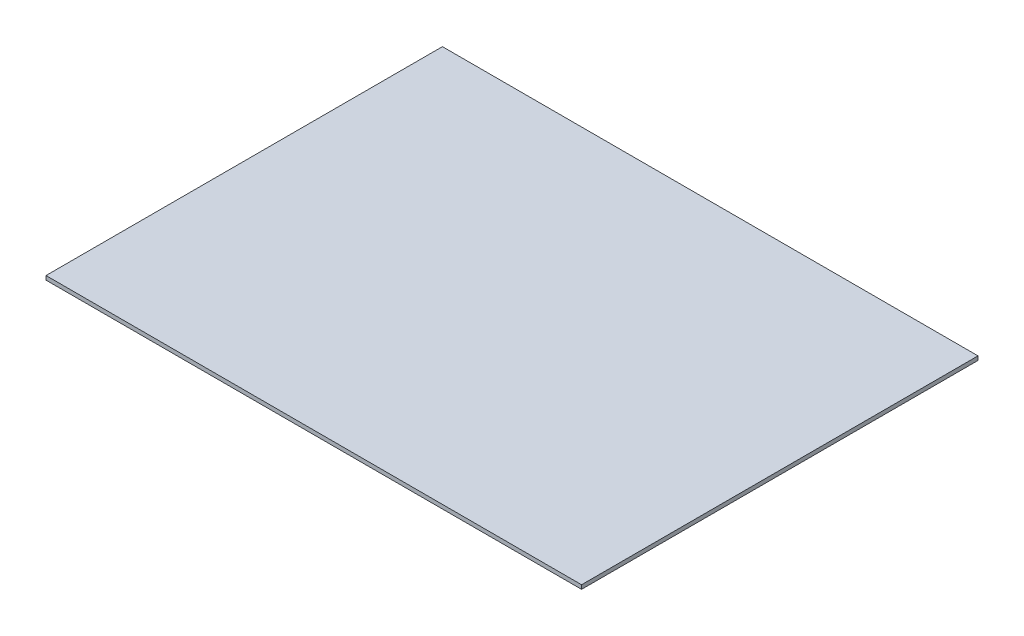
ISO-10303-21;
HEADER;
FILE_DESCRIPTION(('STEP AP214'),'2;1');
FILE_NAME('part.step','',(''),(''),'','','');
FILE_SCHEMA(('AUTOMOTIVE_DESIGN { 1 0 10303 214 1 1 1 1 }'));
ENDSEC;
DATA;
#1=APPLICATION_CONTEXT('core data for automotive mechanical design processes');
#2=APPLICATION_PROTOCOL_DEFINITION('international standard','automotive_design',2000,#1);
#3=PRODUCT_CONTEXT('',#1,'mechanical');
#4=PRODUCT('Part','Part','',(#3));
#5=PRODUCT_RELATED_PRODUCT_CATEGORY('part','',(#4));
#6=PRODUCT_DEFINITION_FORMATION('','',#4);
#7=PRODUCT_DEFINITION_CONTEXT('part definition',#1,'design');
#8=PRODUCT_DEFINITION('design','',#6,#7);
#9=PRODUCT_DEFINITION_SHAPE('','',#8);
#10=(LENGTH_UNIT() NAMED_UNIT(*) SI_UNIT(.MILLI.,.METRE.));
#11=(NAMED_UNIT(*) PLANE_ANGLE_UNIT() SI_UNIT($,.RADIAN.));
#12=(NAMED_UNIT(*) SI_UNIT($,.STERADIAN.) SOLID_ANGLE_UNIT());
#13=UNCERTAINTY_MEASURE_WITH_UNIT(LENGTH_MEASURE(1.E-05),#10,'distance_accuracy_value','');
#14=(GEOMETRIC_REPRESENTATION_CONTEXT(3) GLOBAL_UNCERTAINTY_ASSIGNED_CONTEXT((#13)) GLOBAL_UNIT_ASSIGNED_CONTEXT((#10,
#11,#12)) REPRESENTATION_CONTEXT('',''));
#15=CARTESIAN_POINT('',(0.,0.,0.));
#16=DIRECTION('',(0.,0.,1.));
#17=DIRECTION('',(1.,0.,0.));
#18=AXIS2_PLACEMENT_3D('',#15,#16,#17);
#19=CARTESIAN_POINT('',(-267.5,4.,198.));
#20=DIRECTION('',(1.,0.,0.));
#21=DIRECTION('',(0.,0.,-1.));
#22=AXIS2_PLACEMENT_3D('',#19,#20,#21);
#23=PLANE('',#22);
#24=DIRECTION('',(0.,0.,1.));
#25=VECTOR('',#24,1.);
#26=CARTESIAN_POINT('',(-267.5,0.,198.));
#27=LINE('',#26,#25);
#28=CARTESIAN_POINT('',(-267.5,0.,-198.));
#29=VERTEX_POINT('',#28);
#30=CARTESIAN_POINT('',(-267.5,0.,198.));
#31=VERTEX_POINT('',#30);
#32=EDGE_CURVE('E96',#29,#31,#27,.T.);
#33=ORIENTED_EDGE('',*,*,#32,.T.);
#34=DIRECTION('',(0.,-1.,0.));
#35=VECTOR('',#34,1.);
#36=CARTESIAN_POINT('',(-267.5,4.,198.));
#37=LINE('',#36,#35);
#38=CARTESIAN_POINT('',(-267.5,4.,198.));
#39=VERTEX_POINT('',#38);
#40=EDGE_CURVE('E11',#39,#31,#37,.T.);
#41=ORIENTED_EDGE('',*,*,#40,.F.);
#42=DIRECTION('',(0.,0.,1.));
#43=VECTOR('',#42,1.);
#44=CARTESIAN_POINT('',(-267.5,4.,198.));
#45=LINE('',#44,#43);
#46=CARTESIAN_POINT('',(-267.5,4.,-198.));
#47=VERTEX_POINT('',#46);
#48=EDGE_CURVE('E84',#47,#39,#45,.T.);
#49=ORIENTED_EDGE('',*,*,#48,.F.);
#50=DIRECTION('',(0.,-1.,0.));
#51=VECTOR('',#50,1.);
#52=CARTESIAN_POINT('',(-267.5,4.,-198.));
#53=LINE('',#52,#51);
#54=EDGE_CURVE('E92',#47,#29,#53,.T.);
#55=ORIENTED_EDGE('',*,*,#54,.T.);
#56=EDGE_LOOP('',(#33,#41,#49,#55));
#57=FACE_BOUND('',#56,.T.);
#58=ADVANCED_FACE('F33',(#57),#23,.F.);
#59=CARTESIAN_POINT('',(267.5,4.,198.));
#60=DIRECTION('',(0.,0.,-1.));
#61=DIRECTION('',(-1.,0.,0.));
#62=AXIS2_PLACEMENT_3D('',#59,#60,#61);
#63=PLANE('',#62);
#64=DIRECTION('',(1.,0.,0.));
#65=VECTOR('',#64,1.);
#66=CARTESIAN_POINT('',(267.5,0.,198.));
#67=LINE('',#66,#65);
#68=CARTESIAN_POINT('',(267.5,0.,198.));
#69=VERTEX_POINT('',#68);
#70=EDGE_CURVE('E88',#31,#69,#67,.T.);
#71=ORIENTED_EDGE('',*,*,#70,.T.);
#72=DIRECTION('',(0.,-1.,0.));
#73=VECTOR('',#72,1.);
#74=CARTESIAN_POINT('',(267.5,4.,198.));
#75=LINE('',#74,#73);
#76=CARTESIAN_POINT('',(267.5,4.,198.));
#77=VERTEX_POINT('',#76);
#78=EDGE_CURVE('E41',#77,#69,#75,.T.);
#79=ORIENTED_EDGE('',*,*,#78,.F.);
#80=DIRECTION('',(1.,0.,0.));
#81=VECTOR('',#80,1.);
#82=CARTESIAN_POINT('',(267.5,4.,198.));
#83=LINE('',#82,#81);
#84=EDGE_CURVE('E79',#39,#77,#83,.T.);
#85=ORIENTED_EDGE('',*,*,#84,.F.);
#86=ORIENTED_EDGE('',*,*,#40,.T.);
#87=EDGE_LOOP('',(#71,#79,#85,#86));
#88=FACE_BOUND('',#87,.T.);
#89=ADVANCED_FACE('F87',(#88),#63,.F.);
#90=CARTESIAN_POINT('',(267.5,4.,198.));
#91=DIRECTION('',(-1.,0.,0.));
#92=DIRECTION('',(0.,0.,1.));
#93=AXIS2_PLACEMENT_3D('',#90,#91,#92);
#94=PLANE('',#93);
#95=DIRECTION('',(0.,0.,-1.));
#96=VECTOR('',#95,1.);
#97=CARTESIAN_POINT('',(267.5,0.,198.));
#98=LINE('',#97,#96);
#99=CARTESIAN_POINT('',(267.5,0.,-198.));
#100=VERTEX_POINT('',#99);
#101=EDGE_CURVE('E66',#69,#100,#98,.T.);
#102=ORIENTED_EDGE('',*,*,#101,.T.);
#103=DIRECTION('',(0.,-1.,0.));
#104=VECTOR('',#103,1.);
#105=CARTESIAN_POINT('',(267.5,4.,-198.));
#106=LINE('',#105,#104);
#107=CARTESIAN_POINT('',(267.5,4.,-198.));
#108=VERTEX_POINT('',#107);
#109=EDGE_CURVE('E89',#108,#100,#106,.T.);
#110=ORIENTED_EDGE('',*,*,#109,.F.);
#111=DIRECTION('',(0.,0.,-1.));
#112=VECTOR('',#111,1.);
#113=CARTESIAN_POINT('',(267.5,4.,198.));
#114=LINE('',#113,#112);
#115=EDGE_CURVE('E82',#77,#108,#114,.T.);
#116=ORIENTED_EDGE('',*,*,#115,.F.);
#117=ORIENTED_EDGE('',*,*,#78,.T.);
#118=EDGE_LOOP('',(#102,#110,#116,#117));
#119=FACE_BOUND('',#118,.T.);
#120=ADVANCED_FACE('F90',(#119),#94,.F.);
#121=CARTESIAN_POINT('',(267.5,4.,-198.));
#122=DIRECTION('',(0.,0.,1.));
#123=DIRECTION('',(1.,0.,0.));
#124=AXIS2_PLACEMENT_3D('',#121,#122,#123);
#125=PLANE('',#124);
#126=DIRECTION('',(-1.,0.,0.));
#127=VECTOR('',#126,1.);
#128=CARTESIAN_POINT('',(267.5,0.,-198.));
#129=LINE('',#128,#127);
#130=EDGE_CURVE('E72',#100,#29,#129,.T.);
#131=ORIENTED_EDGE('',*,*,#130,.T.);
#132=ORIENTED_EDGE('',*,*,#54,.F.);
#133=DIRECTION('',(-1.,0.,0.));
#134=VECTOR('',#133,1.);
#135=CARTESIAN_POINT('',(267.5,4.,-198.));
#136=LINE('',#135,#134);
#137=EDGE_CURVE('E49',#108,#47,#136,.T.);
#138=ORIENTED_EDGE('',*,*,#137,.F.);
#139=ORIENTED_EDGE('',*,*,#109,.T.);
#140=EDGE_LOOP('',(#131,#132,#138,#139));
#141=FACE_BOUND('',#140,.T.);
#142=ADVANCED_FACE('F103',(#141),#125,.F.);
#143=CARTESIAN_POINT('',(0.,4.,0.));
#144=DIRECTION('',(0.,1.,0.));
#145=DIRECTION('',(0.,0.,1.));
#146=AXIS2_PLACEMENT_3D('',#143,#144,#145);
#147=PLANE('',#146);
#148=ORIENTED_EDGE('',*,*,#48,.T.);
#149=ORIENTED_EDGE('',*,*,#84,.T.);
#150=ORIENTED_EDGE('',*,*,#115,.T.);
#151=ORIENTED_EDGE('',*,*,#137,.T.);
#152=EDGE_LOOP('',(#148,#149,#150,#151));
#153=FACE_BOUND('',#152,.T.);
#154=ADVANCED_FACE('F80',(#153),#147,.T.);
#155=CARTESIAN_POINT('',(0.,0.,0.));
#156=DIRECTION('',(0.,1.,0.));
#157=DIRECTION('',(0.,0.,1.));
#158=AXIS2_PLACEMENT_3D('',#155,#156,#157);
#159=PLANE('',#158);
#160=ORIENTED_EDGE('',*,*,#32,.F.);
#161=ORIENTED_EDGE('',*,*,#130,.F.);
#162=ORIENTED_EDGE('',*,*,#101,.F.);
#163=ORIENTED_EDGE('',*,*,#70,.F.);
#164=EDGE_LOOP('',(#160,#161,#162,#163));
#165=FACE_BOUND('',#164,.T.);
#166=ADVANCED_FACE('F106',(#165),#159,.F.);
#167=CLOSED_SHELL('',(#58,#89,#120,#142,#154,#166));
#168=MANIFOLD_SOLID_BREP('B2',#167);
#169=ADVANCED_BREP_SHAPE_REPRESENTATION('',(#18,#168),#14);
#170=SHAPE_DEFINITION_REPRESENTATION(#9,#169);
ENDSEC;
END-ISO-10303-21;
